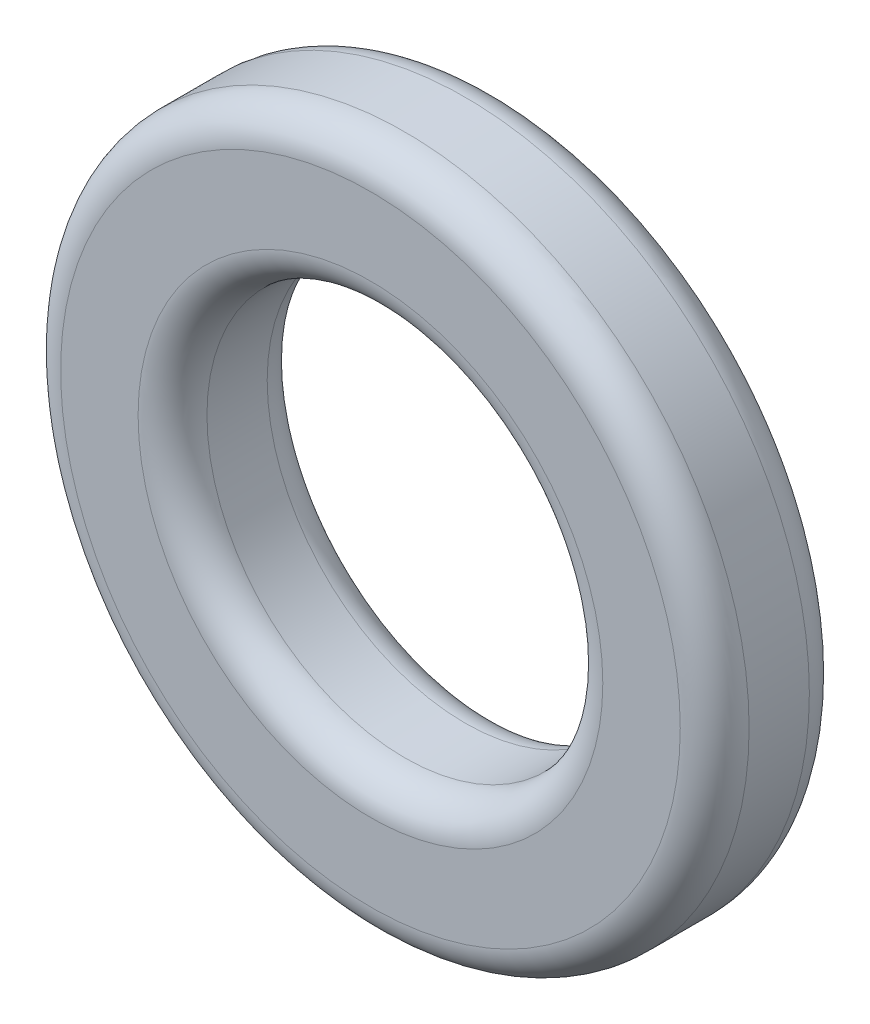
ISO-10303-21;
HEADER;
FILE_DESCRIPTION(('STEP AP214'),'2;1');
FILE_NAME('part.step','',(''),(''),'','','');
FILE_SCHEMA(('AUTOMOTIVE_DESIGN { 1 0 10303 214 1 1 1 1 }'));
ENDSEC;
DATA;
#1=APPLICATION_CONTEXT('core data for automotive mechanical design processes');
#2=APPLICATION_PROTOCOL_DEFINITION('international standard','automotive_design',2000,#1);
#3=PRODUCT_CONTEXT('',#1,'mechanical');
#4=PRODUCT('Part','Part','',(#3));
#5=PRODUCT_RELATED_PRODUCT_CATEGORY('part','',(#4));
#6=PRODUCT_DEFINITION_FORMATION('','',#4);
#7=PRODUCT_DEFINITION_CONTEXT('part definition',#1,'design');
#8=PRODUCT_DEFINITION('design','',#6,#7);
#9=PRODUCT_DEFINITION_SHAPE('','',#8);
#10=(LENGTH_UNIT() NAMED_UNIT(*) SI_UNIT(.MILLI.,.METRE.));
#11=(NAMED_UNIT(*) PLANE_ANGLE_UNIT() SI_UNIT($,.RADIAN.));
#12=(NAMED_UNIT(*) SI_UNIT($,.STERADIAN.) SOLID_ANGLE_UNIT());
#13=UNCERTAINTY_MEASURE_WITH_UNIT(LENGTH_MEASURE(1.E-05),#10,'distance_accuracy_value','');
#14=(GEOMETRIC_REPRESENTATION_CONTEXT(3) GLOBAL_UNCERTAINTY_ASSIGNED_CONTEXT((#13)) GLOBAL_UNIT_ASSIGNED_CONTEXT((#10,
#11,#12)) REPRESENTATION_CONTEXT('',''));
#15=CARTESIAN_POINT('',(0.,0.,0.));
#16=DIRECTION('',(0.,0.,1.));
#17=DIRECTION('',(1.,0.,0.));
#18=AXIS2_PLACEMENT_3D('',#15,#16,#17);
#19=CARTESIAN_POINT('',(0.,0.,1.5));
#20=DIRECTION('',(0.,0.,1.));
#21=DIRECTION('',(1.,0.,0.));
#22=AXIS2_PLACEMENT_3D('',#19,#20,#21);
#23=PLANE('',#22);
#24=CARTESIAN_POINT('',(0.,0.,1.5));
#25=DIRECTION('',(0.,0.,1.));
#26=DIRECTION('',(1.,0.,0.));
#27=AXIS2_PLACEMENT_3D('',#24,#25,#26);
#28=CIRCLE('',#27,2.7);
#29=CARTESIAN_POINT('',(2.7,0.,1.5));
#30=VERTEX_POINT('',#29);
#31=EDGE_CURVE('E10',#30,#30,#28,.F.);
#32=ORIENTED_EDGE('',*,*,#31,.T.);
#33=EDGE_LOOP('',(#32));
#34=FACE_BOUND('',#33,.T.);
#35=CARTESIAN_POINT('',(0.,0.,1.5));
#36=DIRECTION('',(0.,0.,1.));
#37=DIRECTION('',(1.,0.,0.));
#38=AXIS2_PLACEMENT_3D('',#35,#36,#37);
#39=CIRCLE('',#38,3.6);
#40=CARTESIAN_POINT('',(3.6,0.,1.5));
#41=VERTEX_POINT('',#40);
#42=EDGE_CURVE('E37',#41,#41,#39,.T.);
#43=ORIENTED_EDGE('',*,*,#42,.T.);
#44=EDGE_LOOP('',(#43));
#45=FACE_BOUND('',#44,.T.);
#46=ADVANCED_FACE('F30',(#34,#45),#23,.T.);
#47=CARTESIAN_POINT('',(0.,0.,0.));
#48=DIRECTION('',(0.,0.,1.));
#49=DIRECTION('',(1.,0.,0.));
#50=AXIS2_PLACEMENT_3D('',#47,#48,#49);
#51=PLANE('',#50);
#52=CARTESIAN_POINT('',(0.,0.,0.));
#53=DIRECTION('',(0.,0.,1.));
#54=DIRECTION('',(1.,0.,0.));
#55=AXIS2_PLACEMENT_3D('',#52,#53,#54);
#56=CIRCLE('',#55,2.7);
#57=CARTESIAN_POINT('',(2.7,0.,0.));
#58=VERTEX_POINT('',#57);
#59=EDGE_CURVE('E56',#58,#58,#56,.T.);
#60=ORIENTED_EDGE('',*,*,#59,.T.);
#61=EDGE_LOOP('',(#60));
#62=FACE_BOUND('',#61,.T.);
#63=CARTESIAN_POINT('',(0.,0.,0.));
#64=DIRECTION('',(0.,0.,1.));
#65=DIRECTION('',(1.,0.,0.));
#66=AXIS2_PLACEMENT_3D('',#63,#64,#65);
#67=CIRCLE('',#66,3.6);
#68=CARTESIAN_POINT('',(3.6,0.,0.));
#69=VERTEX_POINT('',#68);
#70=EDGE_CURVE('E59',#69,#69,#67,.F.);
#71=ORIENTED_EDGE('',*,*,#70,.T.);
#72=EDGE_LOOP('',(#71));
#73=FACE_BOUND('',#72,.T.);
#74=ADVANCED_FACE('F63',(#62,#73),#51,.F.);
#75=CARTESIAN_POINT('',(0.,0.,1.5));
#76=DIRECTION('',(0.,0.,-1.));
#77=DIRECTION('',(-1.,0.,0.));
#78=AXIS2_PLACEMENT_3D('',#75,#76,#77);
#79=CYLINDRICAL_SURFACE('',#78,4.);
#80=CARTESIAN_POINT('',(0.,0.,0.4));
#81=DIRECTION('',(0.,0.,1.));
#82=DIRECTION('',(1.,0.,0.));
#83=AXIS2_PLACEMENT_3D('',#80,#81,#82);
#84=CIRCLE('',#83,4.);
#85=CARTESIAN_POINT('',(4.,0.,0.4));
#86=VERTEX_POINT('',#85);
#87=EDGE_CURVE('E41',#86,#86,#84,.T.);
#88=ORIENTED_EDGE('',*,*,#87,.T.);
#89=EDGE_LOOP('',(#88));
#90=FACE_BOUND('',#89,.T.);
#91=CARTESIAN_POINT('',(0.,0.,1.1));
#92=DIRECTION('',(0.,0.,1.));
#93=DIRECTION('',(1.,0.,0.));
#94=AXIS2_PLACEMENT_3D('',#91,#92,#93);
#95=CIRCLE('',#94,4.);
#96=CARTESIAN_POINT('',(4.,0.,1.1));
#97=VERTEX_POINT('',#96);
#98=EDGE_CURVE('E45',#97,#97,#95,.F.);
#99=ORIENTED_EDGE('',*,*,#98,.T.);
#100=EDGE_LOOP('',(#99));
#101=FACE_BOUND('',#100,.T.);
#102=ADVANCED_FACE('F73',(#90,#101),#79,.T.);
#103=CARTESIAN_POINT('',(0.,0.,1.5));
#104=DIRECTION('',(0.,0.,-1.));
#105=DIRECTION('',(-1.,0.,0.));
#106=AXIS2_PLACEMENT_3D('',#103,#104,#105);
#107=CYLINDRICAL_SURFACE('',#106,2.3);
#108=CARTESIAN_POINT('',(0.,0.,0.4));
#109=DIRECTION('',(0.,0.,1.));
#110=DIRECTION('',(1.,0.,0.));
#111=AXIS2_PLACEMENT_3D('',#108,#109,#110);
#112=CIRCLE('',#111,2.3);
#113=CARTESIAN_POINT('',(2.3,0.,0.4));
#114=VERTEX_POINT('',#113);
#115=EDGE_CURVE('E50',#114,#114,#112,.F.);
#116=ORIENTED_EDGE('',*,*,#115,.T.);
#117=EDGE_LOOP('',(#116));
#118=FACE_BOUND('',#117,.T.);
#119=CARTESIAN_POINT('',(0.,0.,1.1));
#120=DIRECTION('',(0.,0.,1.));
#121=DIRECTION('',(1.,0.,0.));
#122=AXIS2_PLACEMENT_3D('',#119,#120,#121);
#123=CIRCLE('',#122,2.3);
#124=CARTESIAN_POINT('',(2.3,0.,1.1));
#125=VERTEX_POINT('',#124);
#126=EDGE_CURVE('E53',#125,#125,#123,.T.);
#127=ORIENTED_EDGE('',*,*,#126,.T.);
#128=EDGE_LOOP('',(#127));
#129=FACE_BOUND('',#128,.T.);
#130=ADVANCED_FACE('F76',(#118,#129),#107,.F.);
#131=CARTESIAN_POINT('',(0.,0.,0.4));
#132=DIRECTION('',(0.,0.,1.));
#133=DIRECTION('',(1.,0.,0.));
#134=AXIS2_PLACEMENT_3D('',#131,#132,#133);
#135=TOROIDAL_SURFACE('',#134,2.7,0.4);
#136=ORIENTED_EDGE('',*,*,#115,.F.);
#137=EDGE_LOOP('',(#136));
#138=FACE_BOUND('',#137,.T.);
#139=ORIENTED_EDGE('',*,*,#59,.F.);
#140=EDGE_LOOP('',(#139));
#141=FACE_BOUND('',#140,.T.);
#142=ADVANCED_FACE('F69',(#138,#141),#135,.T.);
#143=CARTESIAN_POINT('',(0.,0.,0.4));
#144=DIRECTION('',(0.,0.,1.));
#145=DIRECTION('',(1.,0.,0.));
#146=AXIS2_PLACEMENT_3D('',#143,#144,#145);
#147=TOROIDAL_SURFACE('',#146,3.6,0.4);
#148=ORIENTED_EDGE('',*,*,#70,.F.);
#149=EDGE_LOOP('',(#148));
#150=FACE_BOUND('',#149,.T.);
#151=ORIENTED_EDGE('',*,*,#87,.F.);
#152=EDGE_LOOP('',(#151));
#153=FACE_BOUND('',#152,.T.);
#154=ADVANCED_FACE('F65',(#150,#153),#147,.T.);
#155=CARTESIAN_POINT('',(0.,0.,1.1));
#156=DIRECTION('',(0.,0.,1.));
#157=DIRECTION('',(1.,0.,0.));
#158=AXIS2_PLACEMENT_3D('',#155,#156,#157);
#159=TOROIDAL_SURFACE('',#158,2.7,0.4);
#160=ORIENTED_EDGE('',*,*,#31,.F.);
#161=EDGE_LOOP('',(#160));
#162=FACE_BOUND('',#161,.T.);
#163=ORIENTED_EDGE('',*,*,#126,.F.);
#164=EDGE_LOOP('',(#163));
#165=FACE_BOUND('',#164,.T.);
#166=ADVANCED_FACE('F68',(#162,#165),#159,.T.);
#167=CARTESIAN_POINT('',(0.,0.,1.1));
#168=DIRECTION('',(0.,0.,1.));
#169=DIRECTION('',(1.,0.,0.));
#170=AXIS2_PLACEMENT_3D('',#167,#168,#169);
#171=TOROIDAL_SURFACE('',#170,3.6,0.4);
#172=ORIENTED_EDGE('',*,*,#98,.F.);
#173=EDGE_LOOP('',(#172));
#174=FACE_BOUND('',#173,.T.);
#175=ORIENTED_EDGE('',*,*,#42,.F.);
#176=EDGE_LOOP('',(#175));
#177=FACE_BOUND('',#176,.T.);
#178=ADVANCED_FACE('F32',(#174,#177),#171,.T.);
#179=CLOSED_SHELL('',(#46,#74,#102,#130,#142,#154,#166,#178));
#180=MANIFOLD_SOLID_BREP('B2',#179);
#181=ADVANCED_BREP_SHAPE_REPRESENTATION('',(#18,#180),#14);
#182=SHAPE_DEFINITION_REPRESENTATION(#9,#181);
ENDSEC;
END-ISO-10303-21;
